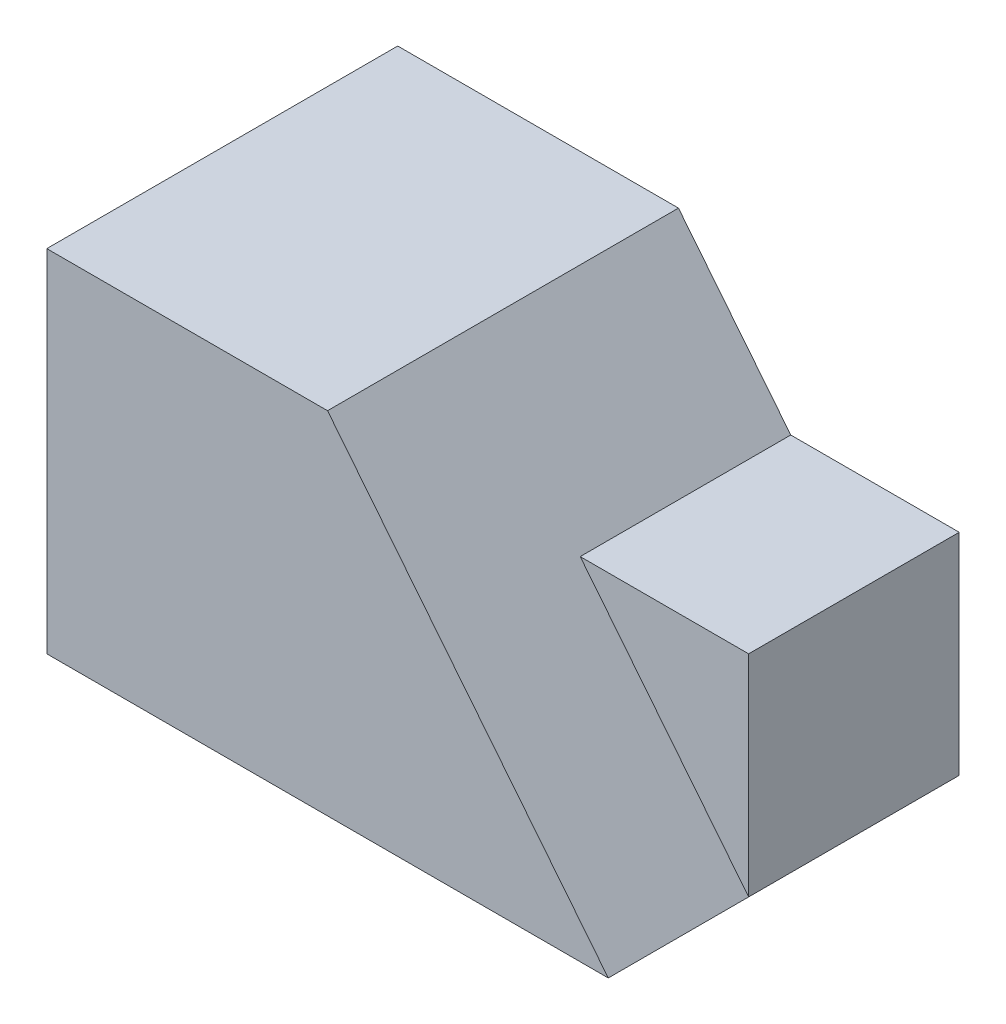
ISO-10303-21;
HEADER;
FILE_DESCRIPTION(('STEP AP214'),'2;1');
FILE_NAME('part.step','',(''),(''),'','','');
FILE_SCHEMA(('AUTOMOTIVE_DESIGN { 1 0 10303 214 1 1 1 1 }'));
ENDSEC;
DATA;
#1=APPLICATION_CONTEXT('core data for automotive mechanical design processes');
#2=APPLICATION_PROTOCOL_DEFINITION('international standard','automotive_design',2000,#1);
#3=PRODUCT_CONTEXT('',#1,'mechanical');
#4=PRODUCT('Part','Part','',(#3));
#5=PRODUCT_RELATED_PRODUCT_CATEGORY('part','',(#4));
#6=PRODUCT_DEFINITION_FORMATION('','',#4);
#7=PRODUCT_DEFINITION_CONTEXT('part definition',#1,'design');
#8=PRODUCT_DEFINITION('design','',#6,#7);
#9=PRODUCT_DEFINITION_SHAPE('','',#8);
#10=(LENGTH_UNIT() NAMED_UNIT(*) SI_UNIT(.MILLI.,.METRE.));
#11=(NAMED_UNIT(*) PLANE_ANGLE_UNIT() SI_UNIT($,.RADIAN.));
#12=(NAMED_UNIT(*) SI_UNIT($,.STERADIAN.) SOLID_ANGLE_UNIT());
#13=UNCERTAINTY_MEASURE_WITH_UNIT(LENGTH_MEASURE(1.E-05),#10,'distance_accuracy_value','');
#14=(GEOMETRIC_REPRESENTATION_CONTEXT(3) GLOBAL_UNCERTAINTY_ASSIGNED_CONTEXT((#13)) GLOBAL_UNIT_ASSIGNED_CONTEXT((#10,
#11,#12)) REPRESENTATION_CONTEXT('',''));
#15=CARTESIAN_POINT('',(0.,0.,0.));
#16=DIRECTION('',(0.,0.,1.));
#17=DIRECTION('',(1.,0.,0.));
#18=AXIS2_PLACEMENT_3D('',#15,#16,#17);
#19=CARTESIAN_POINT('',(0.,25.,55.));
#20=CARTESIAN_POINT('',(0.,25.,35.));
#21=CARTESIAN_POINT('',(0.,25.,15.));
#22=CARTESIAN_POINT('',(0.,25.,-5.));
#23=CARTESIAN_POINT('',(40.,-25.,55.));
#24=CARTESIAN_POINT('',(40.,-25.,35.));
#25=CARTESIAN_POINT('',(40.,-25.,15.));
#26=CARTESIAN_POINT('',(40.,-25.,-5.));
#27=B_SPLINE_SURFACE_WITH_KNOTS('',1,3,((#19,#20,#21,#22),(#23,#24,#25,#26)),.UNSPECIFIED.,.F.,
.F.,.F.,(2,2),(4,4),(0.,1.),(-0.005,0.055),.UNSPECIFIED.);
#28=DIRECTION('',(0.,0.,1.));
#29=VECTOR('',#28,1.);
#30=CARTESIAN_POINT('',(16.,4.99999999999999,25.));
#31=LINE('',#30,#29);
#32=CARTESIAN_POINT('',(16.,5.,0.));
#33=VERTEX_POINT('',#32);
#34=CARTESIAN_POINT('',(16.,4.99999999999999,30.));
#35=VERTEX_POINT('',#34);
#36=EDGE_CURVE('E203',#33,#35,#31,.T.);
#37=CARTESIAN_POINT('',(40.,-25.,0.));
#38=CARTESIAN_POINT('',(0.,25.,0.));
#39=B_SPLINE_CURVE_WITH_KNOTS('',1,(#37,#38),.UNSPECIFIED.,.F.,.F.,(2,2),(0.,1.),.UNSPECIFIED.);
#40=CARTESIAN_POINT('',(0.,25.,0.));
#41=VERTEX_POINT('',#40);
#42=EDGE_CURVE('E13',#41,#33,#39,.F.);
#43=CARTESIAN_POINT('',(0.,25.,-5.));
#44=CARTESIAN_POINT('',(0.,25.,15.));
#45=CARTESIAN_POINT('',(0.,25.,35.));
#46=CARTESIAN_POINT('',(0.,25.,55.));
#47=B_SPLINE_CURVE_WITH_KNOTS('',3,(#43,#44,#45,#46),.UNSPECIFIED.,.F.,.F.,(4,4),(-0.005,0.055),.UNSPECIFIED.);
#48=CARTESIAN_POINT('',(0.,25.,50.));
#49=VERTEX_POINT('',#48);
#50=EDGE_CURVE('E149',#49,#41,#47,.F.);
#51=CARTESIAN_POINT('',(0.,25.,50.));
#52=CARTESIAN_POINT('',(40.,-25.,50.));
#53=B_SPLINE_CURVE_WITH_KNOTS('',1,(#51,#52),.UNSPECIFIED.,.F.,.F.,(2,2),(0.,1.),.UNSPECIFIED.);
#54=CARTESIAN_POINT('',(40.,-25.,50.));
#55=VERTEX_POINT('',#54);
#56=EDGE_CURVE('E54',#55,#49,#53,.F.);
#57=CARTESIAN_POINT('',(40.,-25.,55.));
#58=CARTESIAN_POINT('',(40.,-25.,35.));
#59=CARTESIAN_POINT('',(40.,-25.,15.));
#60=CARTESIAN_POINT('',(40.,-25.,-5.));
#61=B_SPLINE_CURVE_WITH_KNOTS('',3,(#57,#58,#59,#60),.UNSPECIFIED.,.F.,.F.,(4,4),(-0.005,0.055),.UNSPECIFIED.);
#62=CARTESIAN_POINT('',(40.,-25.,30.));
#63=VERTEX_POINT('',#62);
#64=EDGE_CURVE('E239',#55,#63,#61,.T.);
#65=DIRECTION('',(0.624695047554424,-0.78086880944303,0.));
#66=VECTOR('',#65,1.);
#67=CARTESIAN_POINT('',(20.,0.,30.));
#68=LINE('',#67,#66);
#69=EDGE_CURVE('E61',#35,#63,#68,.T.);
#70=ORIENTED_EDGE('',*,*,#36,.F.);
#71=ORIENTED_EDGE('',*,*,#42,.F.);
#72=ORIENTED_EDGE('',*,*,#50,.F.);
#73=ORIENTED_EDGE('',*,*,#56,.F.);
#74=ORIENTED_EDGE('',*,*,#64,.T.);
#75=ORIENTED_EDGE('',*,*,#69,.F.);
#76=EDGE_LOOP('',(#70,#71,#72,#73,#74,#75));
#77=FACE_BOUND('',#76,.T.);
#78=ADVANCED_FACE('F43',(#77),#27,.T.);
#79=CARTESIAN_POINT('',(-40.,-25.,50.));
#80=DIRECTION('',(1.,0.,0.));
#81=DIRECTION('',(0.,0.,-1.));
#82=AXIS2_PLACEMENT_3D('',#79,#80,#81);
#83=PLANE('',#82);
#84=DIRECTION('',(0.,-1.,0.));
#85=VECTOR('',#84,1.);
#86=CARTESIAN_POINT('',(-40.,-25.,0.));
#87=LINE('',#86,#85);
#88=CARTESIAN_POINT('',(-40.,25.,0.));
#89=VERTEX_POINT('',#88);
#90=CARTESIAN_POINT('',(-40.,-25.,0.));
#91=VERTEX_POINT('',#90);
#92=EDGE_CURVE('E110',#89,#91,#87,.T.);
#93=ORIENTED_EDGE('',*,*,#92,.T.);
#94=DIRECTION('',(0.,0.,-1.));
#95=VECTOR('',#94,1.);
#96=CARTESIAN_POINT('',(-40.,-25.,50.));
#97=LINE('',#96,#95);
#98=CARTESIAN_POINT('',(-40.,-25.,50.));
#99=VERTEX_POINT('',#98);
#100=EDGE_CURVE('E104',#99,#91,#97,.T.);
#101=ORIENTED_EDGE('',*,*,#100,.F.);
#102=DIRECTION('',(0.,-1.,0.));
#103=VECTOR('',#102,1.);
#104=CARTESIAN_POINT('',(-40.,-25.,50.));
#105=LINE('',#104,#103);
#106=CARTESIAN_POINT('',(-40.,25.,50.));
#107=VERTEX_POINT('',#106);
#108=EDGE_CURVE('E131',#107,#99,#105,.T.);
#109=ORIENTED_EDGE('',*,*,#108,.F.);
#110=DIRECTION('',(0.,0.,-1.));
#111=VECTOR('',#110,1.);
#112=CARTESIAN_POINT('',(-40.,25.,50.));
#113=LINE('',#112,#111);
#114=EDGE_CURVE('E142',#107,#89,#113,.T.);
#115=ORIENTED_EDGE('',*,*,#114,.T.);
#116=EDGE_LOOP('',(#93,#101,#109,#115));
#117=FACE_BOUND('',#116,.T.);
#118=ADVANCED_FACE('F171',(#117),#83,.F.);
#119=CARTESIAN_POINT('',(40.,-25.,50.));
#120=DIRECTION('',(0.,1.,0.));
#121=DIRECTION('',(-1.,0.,0.));
#122=AXIS2_PLACEMENT_3D('',#119,#120,#121);
#123=PLANE('',#122);
#124=ORIENTED_EDGE('',*,*,#100,.T.);
#125=DIRECTION('',(1.,0.,0.));
#126=VECTOR('',#125,1.);
#127=CARTESIAN_POINT('',(40.,-25.,0.));
#128=LINE('',#127,#126);
#129=CARTESIAN_POINT('',(40.,-25.,0.));
#130=VERTEX_POINT('',#129);
#131=EDGE_CURVE('E101',#91,#130,#128,.T.);
#132=ORIENTED_EDGE('',*,*,#131,.T.);
#133=DIRECTION('',(0.,0.,1.));
#134=VECTOR('',#133,1.);
#135=CARTESIAN_POINT('',(40.,-25.,50.));
#136=LINE('',#135,#134);
#137=EDGE_CURVE('E69',#130,#63,#136,.T.);
#138=ORIENTED_EDGE('',*,*,#137,.T.);
#139=ORIENTED_EDGE('',*,*,#64,.F.);
#140=DIRECTION('',(1.,0.,0.));
#141=VECTOR('',#140,1.);
#142=CARTESIAN_POINT('',(40.,-25.,50.));
#143=LINE('',#142,#141);
#144=EDGE_CURVE('E134',#99,#55,#143,.T.);
#145=ORIENTED_EDGE('',*,*,#144,.F.);
#146=EDGE_LOOP('',(#124,#132,#138,#139,#145));
#147=FACE_BOUND('',#146,.T.);
#148=ADVANCED_FACE('F102',(#147),#123,.F.);
#149=CARTESIAN_POINT('',(40.,25.,50.));
#150=DIRECTION('',(0.,-1.,0.));
#151=DIRECTION('',(1.,0.,0.));
#152=AXIS2_PLACEMENT_3D('',#149,#150,#151);
#153=PLANE('',#152);
#154=DIRECTION('',(-1.,0.,0.));
#155=VECTOR('',#154,1.);
#156=CARTESIAN_POINT('',(40.,25.,50.));
#157=LINE('',#156,#155);
#158=EDGE_CURVE('E139',#49,#107,#157,.T.);
#159=ORIENTED_EDGE('',*,*,#158,.F.);
#160=ORIENTED_EDGE('',*,*,#50,.T.);
#161=DIRECTION('',(-1.,0.,0.));
#162=VECTOR('',#161,1.);
#163=CARTESIAN_POINT('',(40.,25.,0.));
#164=LINE('',#163,#162);
#165=EDGE_CURVE('E109',#41,#89,#164,.T.);
#166=ORIENTED_EDGE('',*,*,#165,.T.);
#167=ORIENTED_EDGE('',*,*,#114,.F.);
#168=EDGE_LOOP('',(#159,#160,#166,#167));
#169=FACE_BOUND('',#168,.T.);
#170=ADVANCED_FACE('F156',(#169),#153,.F.);
#171=CARTESIAN_POINT('',(0.,0.,50.));
#172=DIRECTION('',(0.,0.,1.));
#173=DIRECTION('',(1.,0.,0.));
#174=AXIS2_PLACEMENT_3D('',#171,#172,#173);
#175=PLANE('',#174);
#176=ORIENTED_EDGE('',*,*,#144,.T.);
#177=ORIENTED_EDGE('',*,*,#56,.T.);
#178=ORIENTED_EDGE('',*,*,#158,.T.);
#179=ORIENTED_EDGE('',*,*,#108,.T.);
#180=EDGE_LOOP('',(#176,#177,#178,#179));
#181=FACE_BOUND('',#180,.T.);
#182=ADVANCED_FACE('F166',(#181),#175,.T.);
#183=CARTESIAN_POINT('',(0.,0.,0.));
#184=DIRECTION('',(0.,0.,1.));
#185=DIRECTION('',(1.,0.,0.));
#186=AXIS2_PLACEMENT_3D('',#183,#184,#185);
#187=PLANE('',#186);
#188=ORIENTED_EDGE('',*,*,#42,.T.);
#189=DIRECTION('',(-1.,0.,0.));
#190=VECTOR('',#189,1.);
#191=CARTESIAN_POINT('',(40.,4.99999999999999,0.));
#192=LINE('',#191,#190);
#193=CARTESIAN_POINT('',(40.,4.99999999999999,0.));
#194=VERTEX_POINT('',#193);
#195=EDGE_CURVE('E123',#194,#33,#192,.T.);
#196=ORIENTED_EDGE('',*,*,#195,.F.);
#197=DIRECTION('',(0.,-1.,0.));
#198=VECTOR('',#197,1.);
#199=CARTESIAN_POINT('',(40.,-25.,0.));
#200=LINE('',#199,#198);
#201=EDGE_CURVE('E117',#194,#130,#200,.T.);
#202=ORIENTED_EDGE('',*,*,#201,.T.);
#203=ORIENTED_EDGE('',*,*,#131,.F.);
#204=ORIENTED_EDGE('',*,*,#92,.F.);
#205=ORIENTED_EDGE('',*,*,#165,.F.);
#206=EDGE_LOOP('',(#188,#196,#202,#203,#204,#205));
#207=FACE_BOUND('',#206,.T.);
#208=ADVANCED_FACE('F121',(#207),#187,.F.);
#209=CARTESIAN_POINT('',(40.,4.99999999999999,0.));
#210=DIRECTION('',(0.,1.,0.));
#211=DIRECTION('',(0.,0.,1.));
#212=AXIS2_PLACEMENT_3D('',#209,#210,#211);
#213=PLANE('',#212);
#214=ORIENTED_EDGE('',*,*,#195,.T.);
#215=ORIENTED_EDGE('',*,*,#36,.T.);
#216=DIRECTION('',(-1.,0.,0.));
#217=VECTOR('',#216,1.);
#218=CARTESIAN_POINT('',(40.,4.99999999999999,30.));
#219=LINE('',#218,#217);
#220=CARTESIAN_POINT('',(40.,4.99999999999999,30.));
#221=VERTEX_POINT('',#220);
#222=EDGE_CURVE('E209',#221,#35,#219,.T.);
#223=ORIENTED_EDGE('',*,*,#222,.F.);
#224=DIRECTION('',(0.,0.,-1.));
#225=VECTOR('',#224,1.);
#226=CARTESIAN_POINT('',(40.,4.99999999999999,0.));
#227=LINE('',#226,#225);
#228=EDGE_CURVE('E205',#221,#194,#227,.T.);
#229=ORIENTED_EDGE('',*,*,#228,.T.);
#230=EDGE_LOOP('',(#214,#215,#223,#229));
#231=FACE_BOUND('',#230,.T.);
#232=ADVANCED_FACE('F218',(#231),#213,.T.);
#233=CARTESIAN_POINT('',(40.,-25.,30.));
#234=DIRECTION('',(0.,0.,1.));
#235=DIRECTION('',(1.,0.,0.));
#236=AXIS2_PLACEMENT_3D('',#233,#234,#235);
#237=PLANE('',#236);
#238=ORIENTED_EDGE('',*,*,#222,.T.);
#239=ORIENTED_EDGE('',*,*,#69,.T.);
#240=DIRECTION('',(0.,1.,0.));
#241=VECTOR('',#240,1.);
#242=CARTESIAN_POINT('',(40.,-25.,30.));
#243=LINE('',#242,#241);
#244=EDGE_CURVE('E120',#63,#221,#243,.T.);
#245=ORIENTED_EDGE('',*,*,#244,.T.);
#246=EDGE_LOOP('',(#238,#239,#245));
#247=FACE_BOUND('',#246,.T.);
#248=ADVANCED_FACE('F219',(#247),#237,.T.);
#249=CARTESIAN_POINT('',(40.,0.,0.));
#250=DIRECTION('',(1.,0.,0.));
#251=DIRECTION('',(0.,0.,-1.));
#252=AXIS2_PLACEMENT_3D('',#249,#250,#251);
#253=PLANE('',#252);
#254=ORIENTED_EDGE('',*,*,#201,.F.);
#255=ORIENTED_EDGE('',*,*,#228,.F.);
#256=ORIENTED_EDGE('',*,*,#244,.F.);
#257=ORIENTED_EDGE('',*,*,#137,.F.);
#258=EDGE_LOOP('',(#254,#255,#256,#257));
#259=FACE_BOUND('',#258,.T.);
#260=ADVANCED_FACE('F115',(#259),#253,.T.);
#261=CLOSED_SHELL('',(#78,#118,#148,#170,#182,#208,#232,#248,#260));
#262=MANIFOLD_SOLID_BREP('B2',#261);
#263=ADVANCED_BREP_SHAPE_REPRESENTATION('',(#18,#262),#14);
#264=SHAPE_DEFINITION_REPRESENTATION(#9,#263);
ENDSEC;
END-ISO-10303-21;
